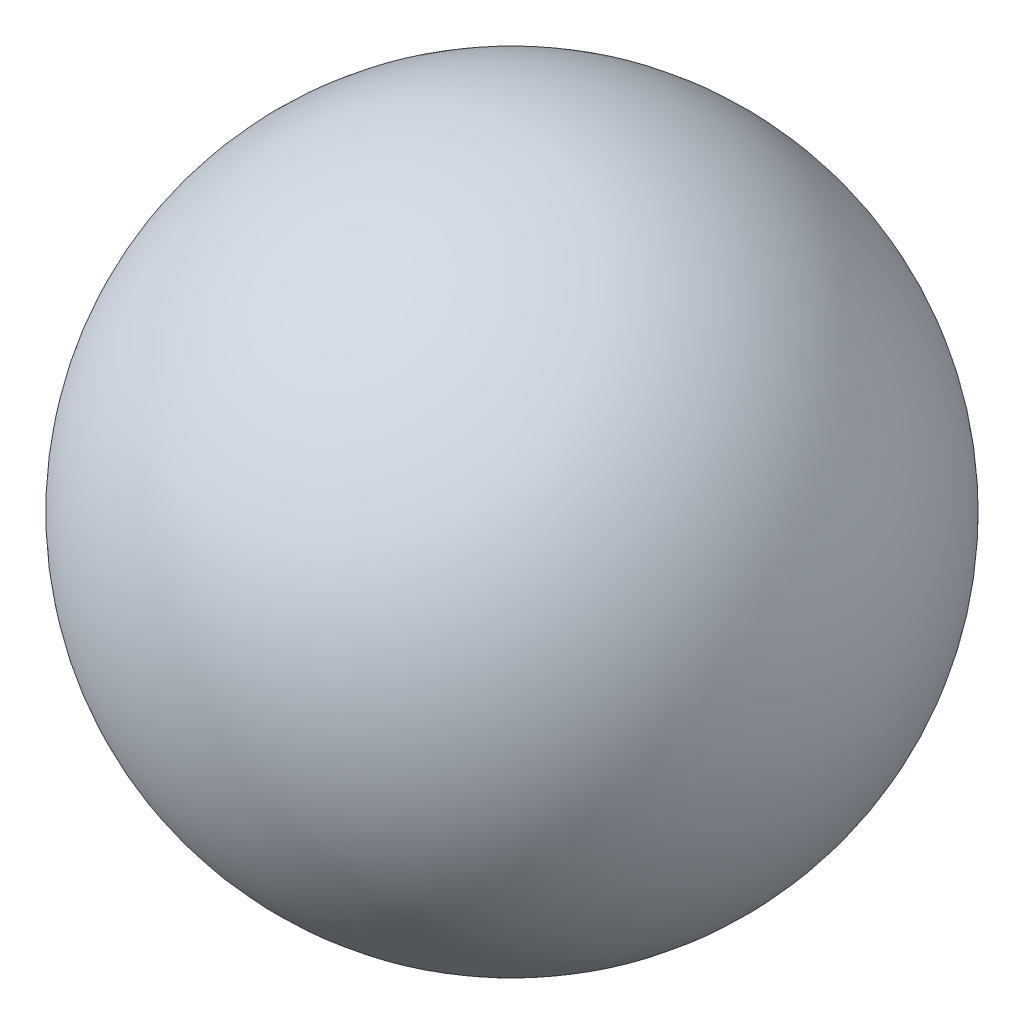
ISO-10303-21;
HEADER;
FILE_DESCRIPTION(('STEP AP214'),'2;1');
FILE_NAME('part.step','',(''),(''),'','','');
FILE_SCHEMA(('AUTOMOTIVE_DESIGN { 1 0 10303 214 1 1 1 1 }'));
ENDSEC;
DATA;
#1=APPLICATION_CONTEXT('core data for automotive mechanical design processes');
#2=APPLICATION_PROTOCOL_DEFINITION('international standard','automotive_design',2000,#1);
#3=PRODUCT_CONTEXT('',#1,'mechanical');
#4=PRODUCT('Part','Part','',(#3));
#5=PRODUCT_RELATED_PRODUCT_CATEGORY('part','',(#4));
#6=PRODUCT_DEFINITION_FORMATION('','',#4);
#7=PRODUCT_DEFINITION_CONTEXT('part definition',#1,'design');
#8=PRODUCT_DEFINITION('design','',#6,#7);
#9=PRODUCT_DEFINITION_SHAPE('','',#8);
#10=(LENGTH_UNIT() NAMED_UNIT(*) SI_UNIT(.MILLI.,.METRE.));
#11=(NAMED_UNIT(*) PLANE_ANGLE_UNIT() SI_UNIT($,.RADIAN.));
#12=(NAMED_UNIT(*) SI_UNIT($,.STERADIAN.) SOLID_ANGLE_UNIT());
#13=UNCERTAINTY_MEASURE_WITH_UNIT(LENGTH_MEASURE(1.E-05),#10,'distance_accuracy_value','');
#14=(GEOMETRIC_REPRESENTATION_CONTEXT(3) GLOBAL_UNCERTAINTY_ASSIGNED_CONTEXT((#13)) GLOBAL_UNIT_ASSIGNED_CONTEXT((#10,
#11,#12)) REPRESENTATION_CONTEXT('',''));
#15=CARTESIAN_POINT('',(0.,0.,0.));
#16=DIRECTION('',(0.,0.,1.));
#17=DIRECTION('',(1.,0.,0.));
#18=AXIS2_PLACEMENT_3D('',#15,#16,#17);
#19=CARTESIAN_POINT('',(0.,0.,0.));
#20=DIRECTION('',(0.,-1.,0.));
#21=DIRECTION('',(-1.,0.,0.));
#22=AXIS2_PLACEMENT_3D('',#19,#20,#21);
#23=SPHERICAL_SURFACE('',#22,8.1);
#24=CARTESIAN_POINT('',(0.,-8.1,0.));
#25=VERTEX_POINT('',#24);
#26=VERTEX_LOOP('',#25);
#27=FACE_BOUND('',#26,.T.);
#28=ADVANCED_FACE('F29',(#27),#23,.T.);
#29=CLOSED_SHELL('',(#28));
#30=MANIFOLD_SOLID_BREP('B2',#29);
#31=ADVANCED_BREP_SHAPE_REPRESENTATION('',(#18,#30),#14);
#32=SHAPE_DEFINITION_REPRESENTATION(#9,#31);
ENDSEC;
END-ISO-10303-21;
